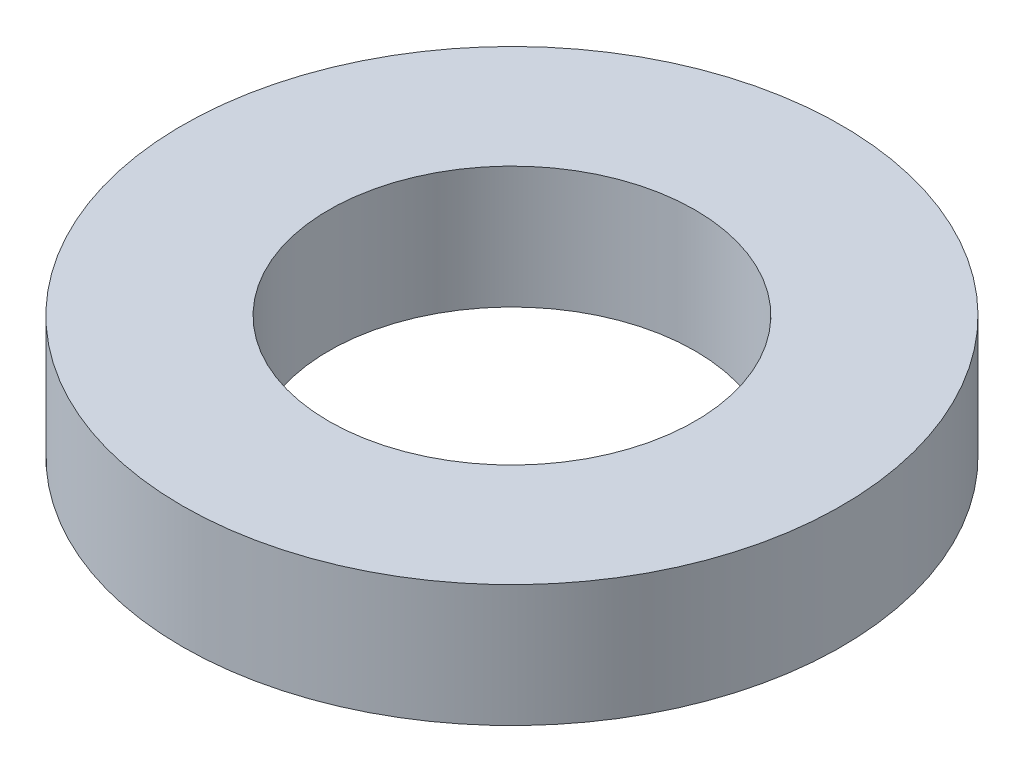
ISO-10303-21;
HEADER;
FILE_DESCRIPTION(('STEP AP214'),'2;1');
FILE_NAME('part.step','',(''),(''),'','','');
FILE_SCHEMA(('AUTOMOTIVE_DESIGN { 1 0 10303 214 1 1 1 1 }'));
ENDSEC;
DATA;
#1=APPLICATION_CONTEXT('core data for automotive mechanical design processes');
#2=APPLICATION_PROTOCOL_DEFINITION('international standard','automotive_design',2000,#1);
#3=PRODUCT_CONTEXT('',#1,'mechanical');
#4=PRODUCT('Part','Part','',(#3));
#5=PRODUCT_RELATED_PRODUCT_CATEGORY('part','',(#4));
#6=PRODUCT_DEFINITION_FORMATION('','',#4);
#7=PRODUCT_DEFINITION_CONTEXT('part definition',#1,'design');
#8=PRODUCT_DEFINITION('design','',#6,#7);
#9=PRODUCT_DEFINITION_SHAPE('','',#8);
#10=(LENGTH_UNIT() NAMED_UNIT(*) SI_UNIT(.MILLI.,.METRE.));
#11=(NAMED_UNIT(*) PLANE_ANGLE_UNIT() SI_UNIT($,.RADIAN.));
#12=(NAMED_UNIT(*) SI_UNIT($,.STERADIAN.) SOLID_ANGLE_UNIT());
#13=UNCERTAINTY_MEASURE_WITH_UNIT(LENGTH_MEASURE(1.E-05),#10,'distance_accuracy_value','');
#14=(GEOMETRIC_REPRESENTATION_CONTEXT(3) GLOBAL_UNCERTAINTY_ASSIGNED_CONTEXT((#13)) GLOBAL_UNIT_ASSIGNED_CONTEXT((#10,
#11,#12)) REPRESENTATION_CONTEXT('',''));
#15=CARTESIAN_POINT('',(0.,0.,0.));
#16=DIRECTION('',(0.,0.,1.));
#17=DIRECTION('',(1.,0.,0.));
#18=AXIS2_PLACEMENT_3D('',#15,#16,#17);
#19=CARTESIAN_POINT('',(0.,5.,0.));
#20=DIRECTION('',(0.,-1.,0.));
#21=DIRECTION('',(0.,0.,-1.));
#22=AXIS2_PLACEMENT_3D('',#19,#20,#21);
#23=CYLINDRICAL_SURFACE('',#22,7.5);
#24=CARTESIAN_POINT('',(0.,5.,0.));
#25=DIRECTION('',(0.,1.,0.));
#26=DIRECTION('',(0.,0.,1.));
#27=AXIS2_PLACEMENT_3D('',#24,#25,#26);
#28=CIRCLE('',#27,7.5);
#29=CARTESIAN_POINT('',(0.,5.,7.5));
#30=VERTEX_POINT('',#29);
#31=EDGE_CURVE('E45',#30,#30,#28,.T.);
#32=ORIENTED_EDGE('',*,*,#31,.T.);
#33=EDGE_LOOP('',(#32));
#34=FACE_BOUND('',#33,.T.);
#35=CARTESIAN_POINT('',(0.,0.,0.));
#36=DIRECTION('',(0.,1.,0.));
#37=DIRECTION('',(0.,0.,1.));
#38=AXIS2_PLACEMENT_3D('',#35,#36,#37);
#39=CIRCLE('',#38,7.5);
#40=CARTESIAN_POINT('',(0.,0.,7.5));
#41=VERTEX_POINT('',#40);
#42=EDGE_CURVE('E52',#41,#41,#39,.T.);
#43=ORIENTED_EDGE('',*,*,#42,.F.);
#44=EDGE_LOOP('',(#43));
#45=FACE_BOUND('',#44,.T.);
#46=ADVANCED_FACE('F37',(#34,#45),#23,.F.);
#47=CARTESIAN_POINT('',(0.,5.,0.));
#48=DIRECTION('',(0.,-1.,0.));
#49=DIRECTION('',(0.,0.,-1.));
#50=AXIS2_PLACEMENT_3D('',#47,#48,#49);
#51=CYLINDRICAL_SURFACE('',#50,13.5);
#52=CARTESIAN_POINT('',(0.,5.,0.));
#53=DIRECTION('',(0.,1.,0.));
#54=DIRECTION('',(0.,0.,1.));
#55=AXIS2_PLACEMENT_3D('',#52,#53,#54);
#56=CIRCLE('',#55,13.5);
#57=CARTESIAN_POINT('',(0.,5.,13.5));
#58=VERTEX_POINT('',#57);
#59=EDGE_CURVE('E10',#58,#58,#56,.T.);
#60=ORIENTED_EDGE('',*,*,#59,.F.);
#61=EDGE_LOOP('',(#60));
#62=FACE_BOUND('',#61,.T.);
#63=CARTESIAN_POINT('',(0.,0.,0.));
#64=DIRECTION('',(0.,1.,0.));
#65=DIRECTION('',(0.,0.,1.));
#66=AXIS2_PLACEMENT_3D('',#63,#64,#65);
#67=CIRCLE('',#66,13.5);
#68=CARTESIAN_POINT('',(0.,0.,13.5));
#69=VERTEX_POINT('',#68);
#70=EDGE_CURVE('E40',#69,#69,#67,.T.);
#71=ORIENTED_EDGE('',*,*,#70,.T.);
#72=EDGE_LOOP('',(#71));
#73=FACE_BOUND('',#72,.T.);
#74=ADVANCED_FACE('F61',(#62,#73),#51,.T.);
#75=CARTESIAN_POINT('',(0.,5.,0.));
#76=DIRECTION('',(0.,1.,0.));
#77=DIRECTION('',(0.,0.,1.));
#78=AXIS2_PLACEMENT_3D('',#75,#76,#77);
#79=PLANE('',#78);
#80=ORIENTED_EDGE('',*,*,#31,.F.);
#81=EDGE_LOOP('',(#80));
#82=FACE_BOUND('',#81,.T.);
#83=ORIENTED_EDGE('',*,*,#59,.T.);
#84=EDGE_LOOP('',(#83));
#85=FACE_BOUND('',#84,.T.);
#86=ADVANCED_FACE('F65',(#82,#85),#79,.T.);
#87=CARTESIAN_POINT('',(0.,0.,0.));
#88=DIRECTION('',(0.,1.,0.));
#89=DIRECTION('',(0.,0.,1.));
#90=AXIS2_PLACEMENT_3D('',#87,#88,#89);
#91=PLANE('',#90);
#92=ORIENTED_EDGE('',*,*,#42,.T.);
#93=EDGE_LOOP('',(#92));
#94=FACE_BOUND('',#93,.T.);
#95=ORIENTED_EDGE('',*,*,#70,.F.);
#96=EDGE_LOOP('',(#95));
#97=FACE_BOUND('',#96,.T.);
#98=ADVANCED_FACE('F63',(#94,#97),#91,.F.);
#99=CLOSED_SHELL('',(#46,#74,#86,#98));
#100=MANIFOLD_SOLID_BREP('B2',#99);
#101=ADVANCED_BREP_SHAPE_REPRESENTATION('',(#18,#100),#14);
#102=SHAPE_DEFINITION_REPRESENTATION(#9,#101);
ENDSEC;
END-ISO-10303-21;
